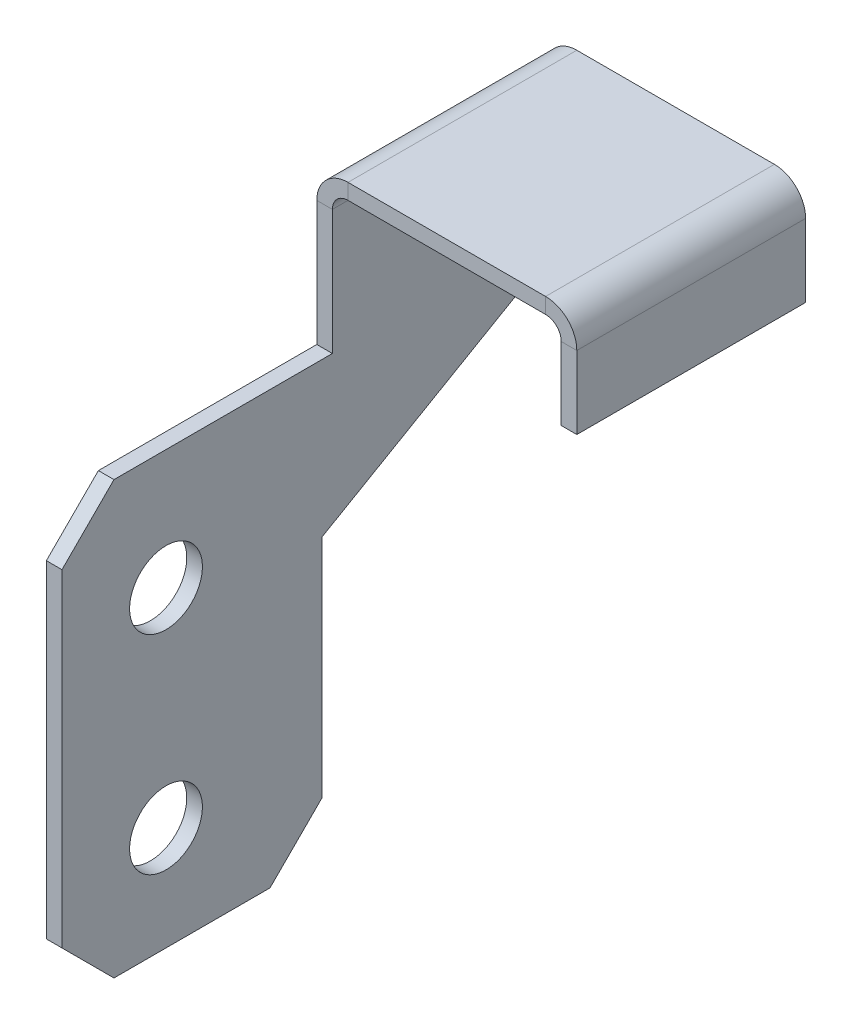
ISO-10303-21;
HEADER;
FILE_DESCRIPTION(('STEP AP214'),'2;1');
FILE_NAME('part.step','',(''),(''),'','','');
FILE_SCHEMA(('AUTOMOTIVE_DESIGN { 1 0 10303 214 1 1 1 1 }'));
ENDSEC;
DATA;
#1=APPLICATION_CONTEXT('core data for automotive mechanical design processes');
#2=APPLICATION_PROTOCOL_DEFINITION('international standard','automotive_design',2000,#1);
#3=PRODUCT_CONTEXT('',#1,'mechanical');
#4=PRODUCT('Part','Part','',(#3));
#5=PRODUCT_RELATED_PRODUCT_CATEGORY('part','',(#4));
#6=PRODUCT_DEFINITION_FORMATION('','',#4);
#7=PRODUCT_DEFINITION_CONTEXT('part definition',#1,'design');
#8=PRODUCT_DEFINITION('design','',#6,#7);
#9=PRODUCT_DEFINITION_SHAPE('','',#8);
#10=(LENGTH_UNIT() NAMED_UNIT(*) SI_UNIT(.MILLI.,.METRE.));
#11=(NAMED_UNIT(*) PLANE_ANGLE_UNIT() SI_UNIT($,.RADIAN.));
#12=(NAMED_UNIT(*) SI_UNIT($,.STERADIAN.) SOLID_ANGLE_UNIT());
#13=UNCERTAINTY_MEASURE_WITH_UNIT(LENGTH_MEASURE(1.E-05),#10,'distance_accuracy_value','');
#14=(GEOMETRIC_REPRESENTATION_CONTEXT(3) GLOBAL_UNCERTAINTY_ASSIGNED_CONTEXT((#13)) GLOBAL_UNIT_ASSIGNED_CONTEXT((#10,
#11,#12)) REPRESENTATION_CONTEXT('',''));
#15=CARTESIAN_POINT('',(0.,0.,0.));
#16=DIRECTION('',(0.,0.,1.));
#17=DIRECTION('',(1.,0.,0.));
#18=AXIS2_PLACEMENT_3D('',#15,#16,#17);
#19=CARTESIAN_POINT('',(26.,41.5,22.));
#20=DIRECTION('',(0.,0.,-1.));
#21=DIRECTION('',(-1.,0.,0.));
#22=AXIS2_PLACEMENT_3D('',#19,#20,#21);
#23=PLANE('',#22);
#24=DIRECTION('',(0.,1.,0.));
#25=VECTOR('',#24,1.);
#26=CARTESIAN_POINT('',(25.,56.5,22.));
#27=LINE('',#26,#25);
#28=CARTESIAN_POINT('',(25.,46.5,22.));
#29=VERTEX_POINT('',#28);
#30=CARTESIAN_POINT('',(25.,53.5,22.));
#31=VERTEX_POINT('',#30);
#32=EDGE_CURVE('E212',#29,#31,#27,.T.);
#33=ORIENTED_EDGE('',*,*,#32,.T.);
#34=DIRECTION('',(-1.,0.,0.));
#35=VECTOR('',#34,1.);
#36=CARTESIAN_POINT('',(25.,53.5,22.));
#37=LINE('',#36,#35);
#38=CARTESIAN_POINT('',(23.5,53.5,22.));
#39=VERTEX_POINT('',#38);
#40=EDGE_CURVE('E329',#31,#39,#37,.T.);
#41=ORIENTED_EDGE('',*,*,#40,.T.);
#42=DIRECTION('',(0.,1.,0.));
#43=VECTOR('',#42,1.);
#44=CARTESIAN_POINT('',(23.5,56.5,22.));
#45=LINE('',#44,#43);
#46=CARTESIAN_POINT('',(23.5,46.5,22.));
#47=VERTEX_POINT('',#46);
#48=EDGE_CURVE('E201',#47,#39,#45,.T.);
#49=ORIENTED_EDGE('',*,*,#48,.F.);
#50=DIRECTION('',(1.,0.,0.));
#51=VECTOR('',#50,1.);
#52=CARTESIAN_POINT('',(25.,46.5,22.));
#53=LINE('',#52,#51);
#54=EDGE_CURVE('E205',#47,#29,#53,.T.);
#55=ORIENTED_EDGE('',*,*,#54,.T.);
#56=EDGE_LOOP('',(#33,#41,#49,#55));
#57=FACE_BOUND('',#56,.T.);
#58=ADVANCED_FACE('F43',(#57),#23,.F.);
#59=DIRECTION('',(-1.,0.,0.));
#60=VECTOR('',#59,1.);
#61=CARTESIAN_POINT('',(0.,55.,22.));
#62=LINE('',#61,#60);
#63=CARTESIAN_POINT('',(22.,55.,22.));
#64=VERTEX_POINT('',#63);
#65=CARTESIAN_POINT('',(3.,55.,22.));
#66=VERTEX_POINT('',#65);
#67=EDGE_CURVE('E207',#64,#66,#62,.T.);
#68=ORIENTED_EDGE('',*,*,#67,.F.);
#69=DIRECTION('',(0.,1.,0.));
#70=VECTOR('',#69,1.);
#71=CARTESIAN_POINT('',(22.,55.,22.));
#72=LINE('',#71,#70);
#73=CARTESIAN_POINT('',(22.,56.5,22.));
#74=VERTEX_POINT('',#73);
#75=EDGE_CURVE('E327',#64,#74,#72,.T.);
#76=ORIENTED_EDGE('',*,*,#75,.T.);
#77=DIRECTION('',(-1.,0.,0.));
#78=VECTOR('',#77,1.);
#79=CARTESIAN_POINT('',(26.,56.5,22.));
#80=LINE('',#79,#78);
#81=CARTESIAN_POINT('',(3.,56.5,22.));
#82=VERTEX_POINT('',#81);
#83=EDGE_CURVE('E195',#74,#82,#80,.T.);
#84=ORIENTED_EDGE('',*,*,#83,.T.);
#85=DIRECTION('',(0.,-1.,0.));
#86=VECTOR('',#85,1.);
#87=CARTESIAN_POINT('',(3.,56.5,22.));
#88=LINE('',#87,#86);
#89=EDGE_CURVE('E323',#82,#66,#88,.T.);
#90=ORIENTED_EDGE('',*,*,#89,.T.);
#91=EDGE_LOOP('',(#68,#76,#84,#90));
#92=FACE_BOUND('',#91,.T.);
#93=ADVANCED_FACE('F378',(#92),#23,.F.);
#94=DIRECTION('',(0.,-1.,0.));
#95=VECTOR('',#94,1.);
#96=CARTESIAN_POINT('',(1.5,0.,22.));
#97=LINE('',#96,#95);
#98=CARTESIAN_POINT('',(1.5,53.5,22.));
#99=VERTEX_POINT('',#98);
#100=CARTESIAN_POINT('',(1.5,41.5,22.));
#101=VERTEX_POINT('',#100);
#102=EDGE_CURVE('E191',#99,#101,#97,.T.);
#103=ORIENTED_EDGE('',*,*,#102,.F.);
#104=DIRECTION('',(-1.,0.,0.));
#105=VECTOR('',#104,1.);
#106=CARTESIAN_POINT('',(1.5,53.5,22.));
#107=LINE('',#106,#105);
#108=CARTESIAN_POINT('',(0.,53.5,22.));
#109=VERTEX_POINT('',#108);
#110=EDGE_CURVE('E325',#99,#109,#107,.T.);
#111=ORIENTED_EDGE('',*,*,#110,.T.);
#112=DIRECTION('',(0.,-1.,0.));
#113=VECTOR('',#112,1.);
#114=CARTESIAN_POINT('',(0.,0.,22.));
#115=LINE('',#114,#113);
#116=CARTESIAN_POINT('',(0.,41.5,22.));
#117=VERTEX_POINT('',#116);
#118=EDGE_CURVE('E194',#109,#117,#115,.T.);
#119=ORIENTED_EDGE('',*,*,#118,.T.);
#120=DIRECTION('',(-1.,0.,0.));
#121=VECTOR('',#120,1.);
#122=CARTESIAN_POINT('',(26.,41.5,22.));
#123=LINE('',#122,#121);
#124=EDGE_CURVE('E178',#101,#117,#123,.T.);
#125=ORIENTED_EDGE('',*,*,#124,.F.);
#126=EDGE_LOOP('',(#103,#111,#119,#125));
#127=FACE_BOUND('',#126,.T.);
#128=ADVANCED_FACE('F190',(#127),#23,.F.);
#129=ORIENTED_EDGE('',*,*,#40,.F.);
#130=CARTESIAN_POINT('',(22.,53.5,22.));
#131=DIRECTION('',(0.,0.,-1.));
#132=DIRECTION('',(-1.,0.,0.));
#133=AXIS2_PLACEMENT_3D('',#130,#131,#132);
#134=CIRCLE('',#133,3.);
#135=EDGE_CURVE('E215',#31,#74,#134,.F.);
#136=ORIENTED_EDGE('',*,*,#135,.T.);
#137=ORIENTED_EDGE('',*,*,#75,.F.);
#138=CARTESIAN_POINT('',(22.,53.5,22.));
#139=DIRECTION('',(0.,0.,-1.));
#140=DIRECTION('',(-1.,0.,0.));
#141=AXIS2_PLACEMENT_3D('',#138,#139,#140);
#142=CIRCLE('',#141,1.5);
#143=EDGE_CURVE('E320',#39,#64,#142,.F.);
#144=ORIENTED_EDGE('',*,*,#143,.F.);
#145=EDGE_LOOP('',(#129,#136,#137,#144));
#146=FACE_BOUND('',#145,.T.);
#147=ADVANCED_FACE('F391',(#146),#23,.F.);
#148=CARTESIAN_POINT('',(22.,53.5,48.));
#149=DIRECTION('',(0.,0.,1.));
#150=DIRECTION('',(1.,0.,0.));
#151=AXIS2_PLACEMENT_3D('',#148,#149,#150);
#152=PLANE('',#151);
#153=DIRECTION('',(0.,1.,0.));
#154=VECTOR('',#153,1.);
#155=CARTESIAN_POINT('',(0.,0.,48.));
#156=LINE('',#155,#154);
#157=CARTESIAN_POINT('',(0.,5.00000000000004,48.));
#158=VERTEX_POINT('',#157);
#159=CARTESIAN_POINT('',(0.,36.5,48.));
#160=VERTEX_POINT('',#159);
#161=EDGE_CURVE('E250',#158,#160,#156,.T.);
#162=ORIENTED_EDGE('',*,*,#161,.F.);
#163=DIRECTION('',(1.,0.,0.));
#164=VECTOR('',#163,1.);
#165=CARTESIAN_POINT('',(22.,5.00000000000004,48.));
#166=LINE('',#165,#164);
#167=CARTESIAN_POINT('',(1.5,5.00000000000004,48.));
#168=VERTEX_POINT('',#167);
#169=EDGE_CURVE('E344',#158,#168,#166,.T.);
#170=ORIENTED_EDGE('',*,*,#169,.T.);
#171=DIRECTION('',(0.,1.,0.));
#172=VECTOR('',#171,1.);
#173=CARTESIAN_POINT('',(1.5,0.,48.));
#174=LINE('',#173,#172);
#175=CARTESIAN_POINT('',(1.5,36.5,48.));
#176=VERTEX_POINT('',#175);
#177=EDGE_CURVE('E252',#168,#176,#174,.T.);
#178=ORIENTED_EDGE('',*,*,#177,.T.);
#179=DIRECTION('',(-1.,0.,0.));
#180=VECTOR('',#179,1.);
#181=CARTESIAN_POINT('',(22.,36.5,48.));
#182=LINE('',#181,#180);
#183=EDGE_CURVE('E331',#176,#160,#182,.T.);
#184=ORIENTED_EDGE('',*,*,#183,.T.);
#185=EDGE_LOOP('',(#162,#170,#178,#184));
#186=FACE_BOUND('',#185,.T.);
#187=ADVANCED_FACE('F402',(#186),#152,.T.);
#188=CARTESIAN_POINT('',(0.,53.5,0.));
#189=DIRECTION('',(0.,0.,-1.));
#190=DIRECTION('',(-1.,0.,0.));
#191=AXIS2_PLACEMENT_3D('',#188,#189,#190);
#192=PLANE('',#191);
#193=DIRECTION('',(1.,0.,0.));
#194=VECTOR('',#193,1.);
#195=CARTESIAN_POINT('',(0.,53.5,0.));
#196=LINE('',#195,#194);
#197=CARTESIAN_POINT('',(0.,53.5,0.));
#198=VERTEX_POINT('',#197);
#199=CARTESIAN_POINT('',(1.5,53.5,0.));
#200=VERTEX_POINT('',#199);
#201=EDGE_CURVE('E317',#198,#200,#196,.T.);
#202=ORIENTED_EDGE('',*,*,#201,.F.);
#203=CARTESIAN_POINT('',(3.,53.5,0.));
#204=DIRECTION('',(0.,0.,1.));
#205=DIRECTION('',(1.,0.,0.));
#206=AXIS2_PLACEMENT_3D('',#203,#204,#205);
#207=CIRCLE('',#206,3.);
#208=CARTESIAN_POINT('',(3.,56.5,0.));
#209=VERTEX_POINT('',#208);
#210=EDGE_CURVE('E270',#198,#209,#207,.F.);
#211=ORIENTED_EDGE('',*,*,#210,.T.);
#212=DIRECTION('',(0.,1.,0.));
#213=VECTOR('',#212,1.);
#214=CARTESIAN_POINT('',(3.,55.,0.));
#215=LINE('',#214,#213);
#216=CARTESIAN_POINT('',(3.,55.,0.));
#217=VERTEX_POINT('',#216);
#218=EDGE_CURVE('E314',#217,#209,#215,.T.);
#219=ORIENTED_EDGE('',*,*,#218,.F.);
#220=CARTESIAN_POINT('',(3.,53.5,0.));
#221=DIRECTION('',(0.,0.,1.));
#222=DIRECTION('',(1.,0.,0.));
#223=AXIS2_PLACEMENT_3D('',#220,#221,#222);
#224=CIRCLE('',#223,1.5);
#225=EDGE_CURVE('E278',#200,#217,#224,.F.);
#226=ORIENTED_EDGE('',*,*,#225,.F.);
#227=EDGE_LOOP('',(#202,#211,#219,#226));
#228=FACE_BOUND('',#227,.T.);
#229=ADVANCED_FACE('F408',(#228),#192,.T.);
#230=CARTESIAN_POINT('',(3.,55.,0.));
#231=DIRECTION('',(0.,0.,-1.));
#232=DIRECTION('',(-1.,0.,0.));
#233=AXIS2_PLACEMENT_3D('',#230,#231,#232);
#234=PLANE('',#233);
#235=DIRECTION('',(-1.,0.,0.));
#236=VECTOR('',#235,1.);
#237=CARTESIAN_POINT('',(1.5,40.,0.));
#238=LINE('',#237,#236);
#239=CARTESIAN_POINT('',(1.5,40.,0.));
#240=VERTEX_POINT('',#239);
#241=CARTESIAN_POINT('',(0.,40.,0.));
#242=VERTEX_POINT('',#241);
#243=EDGE_CURVE('E244',#240,#242,#238,.T.);
#244=ORIENTED_EDGE('',*,*,#243,.T.);
#245=DIRECTION('',(0.,1.,0.));
#246=VECTOR('',#245,1.);
#247=CARTESIAN_POINT('',(0.,0.,0.));
#248=LINE('',#247,#246);
#249=EDGE_CURVE('E273',#242,#198,#248,.T.);
#250=ORIENTED_EDGE('',*,*,#249,.T.);
#251=ORIENTED_EDGE('',*,*,#201,.T.);
#252=DIRECTION('',(0.,1.,0.));
#253=VECTOR('',#252,1.);
#254=CARTESIAN_POINT('',(1.5,0.,0.));
#255=LINE('',#254,#253);
#256=EDGE_CURVE('E276',#240,#200,#255,.T.);
#257=ORIENTED_EDGE('',*,*,#256,.F.);
#258=EDGE_LOOP('',(#244,#250,#251,#257));
#259=FACE_BOUND('',#258,.T.);
#260=ADVANCED_FACE('F367',(#259),#234,.T.);
#261=CARTESIAN_POINT('',(22.,56.5,0.));
#262=DIRECTION('',(0.,0.,-1.));
#263=DIRECTION('',(-1.,0.,0.));
#264=AXIS2_PLACEMENT_3D('',#261,#262,#263);
#265=PLANE('',#264);
#266=DIRECTION('',(0.,-1.,0.));
#267=VECTOR('',#266,1.);
#268=CARTESIAN_POINT('',(22.,56.5,0.));
#269=LINE('',#268,#267);
#270=CARTESIAN_POINT('',(22.,56.5,0.));
#271=VERTEX_POINT('',#270);
#272=CARTESIAN_POINT('',(22.,55.,0.));
#273=VERTEX_POINT('',#272);
#274=EDGE_CURVE('E311',#271,#273,#269,.T.);
#275=ORIENTED_EDGE('',*,*,#274,.F.);
#276=CARTESIAN_POINT('',(22.,53.5,0.));
#277=DIRECTION('',(0.,0.,1.));
#278=DIRECTION('',(1.,0.,0.));
#279=AXIS2_PLACEMENT_3D('',#276,#277,#278);
#280=CIRCLE('',#279,3.);
#281=CARTESIAN_POINT('',(25.,53.5,0.));
#282=VERTEX_POINT('',#281);
#283=EDGE_CURVE('E264',#271,#282,#280,.F.);
#284=ORIENTED_EDGE('',*,*,#283,.T.);
#285=DIRECTION('',(1.,0.,0.));
#286=VECTOR('',#285,1.);
#287=CARTESIAN_POINT('',(23.5,53.5,0.));
#288=LINE('',#287,#286);
#289=CARTESIAN_POINT('',(23.5,53.5,0.));
#290=VERTEX_POINT('',#289);
#291=EDGE_CURVE('E308',#290,#282,#288,.T.);
#292=ORIENTED_EDGE('',*,*,#291,.F.);
#293=CARTESIAN_POINT('',(22.,53.5,0.));
#294=DIRECTION('',(0.,0.,1.));
#295=DIRECTION('',(1.,0.,0.));
#296=AXIS2_PLACEMENT_3D('',#293,#294,#295);
#297=CIRCLE('',#296,1.5);
#298=EDGE_CURVE('E253',#273,#290,#297,.F.);
#299=ORIENTED_EDGE('',*,*,#298,.F.);
#300=EDGE_LOOP('',(#275,#284,#292,#299));
#301=FACE_BOUND('',#300,.T.);
#302=ADVANCED_FACE('F430',(#301),#265,.T.);
#303=CARTESIAN_POINT('',(23.5,53.5,0.));
#304=DIRECTION('',(0.,0.,-1.));
#305=DIRECTION('',(-1.,0.,0.));
#306=AXIS2_PLACEMENT_3D('',#303,#304,#305);
#307=PLANE('',#306);
#308=DIRECTION('',(1.,0.,0.));
#309=VECTOR('',#308,1.);
#310=CARTESIAN_POINT('',(0.,56.5,0.));
#311=LINE('',#310,#309);
#312=EDGE_CURVE('E267',#209,#271,#311,.T.);
#313=ORIENTED_EDGE('',*,*,#312,.T.);
#314=ORIENTED_EDGE('',*,*,#274,.T.);
#315=DIRECTION('',(1.,0.,0.));
#316=VECTOR('',#315,1.);
#317=CARTESIAN_POINT('',(0.,55.,0.));
#318=LINE('',#317,#316);
#319=EDGE_CURVE('E281',#217,#273,#318,.T.);
#320=ORIENTED_EDGE('',*,*,#319,.F.);
#321=ORIENTED_EDGE('',*,*,#218,.T.);
#322=EDGE_LOOP('',(#313,#314,#320,#321));
#323=FACE_BOUND('',#322,.T.);
#324=ADVANCED_FACE('F434',(#323),#307,.T.);
#325=CARTESIAN_POINT('',(23.5,56.5,48.));
#326=DIRECTION('',(1.,0.,0.));
#327=DIRECTION('',(0.,0.,-1.));
#328=AXIS2_PLACEMENT_3D('',#325,#326,#327);
#329=PLANE('',#328);
#330=DIRECTION('',(0.,0.,-1.));
#331=VECTOR('',#330,1.);
#332=CARTESIAN_POINT('',(23.5,46.5,48.));
#333=LINE('',#332,#331);
#334=CARTESIAN_POINT('',(23.5,46.5,0.));
#335=VERTEX_POINT('',#334);
#336=EDGE_CURVE('E306',#47,#335,#333,.T.);
#337=ORIENTED_EDGE('',*,*,#336,.F.);
#338=ORIENTED_EDGE('',*,*,#48,.T.);
#339=DIRECTION('',(0.,0.,-1.));
#340=VECTOR('',#339,1.);
#341=CARTESIAN_POINT('',(23.5,53.5,48.));
#342=LINE('',#341,#340);
#343=EDGE_CURVE('E255',#39,#290,#342,.T.);
#344=ORIENTED_EDGE('',*,*,#343,.T.);
#345=DIRECTION('',(0.,1.,0.));
#346=VECTOR('',#345,1.);
#347=CARTESIAN_POINT('',(23.5,56.5,0.));
#348=LINE('',#347,#346);
#349=EDGE_CURVE('E247',#290,#335,#348,.F.);
#350=ORIENTED_EDGE('',*,*,#349,.T.);
#351=EDGE_LOOP('',(#337,#338,#344,#350));
#352=FACE_BOUND('',#351,.T.);
#353=ADVANCED_FACE('F464',(#352),#329,.F.);
#354=CARTESIAN_POINT('',(25.,46.5,48.));
#355=DIRECTION('',(0.,-1.,0.));
#356=DIRECTION('',(0.,0.,-1.));
#357=AXIS2_PLACEMENT_3D('',#354,#355,#356);
#358=PLANE('',#357);
#359=ORIENTED_EDGE('',*,*,#54,.F.);
#360=ORIENTED_EDGE('',*,*,#336,.T.);
#361=DIRECTION('',(-1.,0.,0.));
#362=VECTOR('',#361,1.);
#363=CARTESIAN_POINT('',(25.,46.5,0.));
#364=LINE('',#363,#362);
#365=CARTESIAN_POINT('',(25.,46.5,0.));
#366=VERTEX_POINT('',#365);
#367=EDGE_CURVE('E258',#366,#335,#364,.T.);
#368=ORIENTED_EDGE('',*,*,#367,.F.);
#369=DIRECTION('',(0.,0.,-1.));
#370=VECTOR('',#369,1.);
#371=CARTESIAN_POINT('',(25.,46.5,48.));
#372=LINE('',#371,#370);
#373=EDGE_CURVE('E304',#29,#366,#372,.T.);
#374=ORIENTED_EDGE('',*,*,#373,.F.);
#375=EDGE_LOOP('',(#359,#360,#368,#374));
#376=FACE_BOUND('',#375,.T.);
#377=ADVANCED_FACE('F466',(#376),#358,.T.);
#378=CARTESIAN_POINT('',(25.,56.5,48.));
#379=DIRECTION('',(1.,0.,0.));
#380=DIRECTION('',(0.,0.,-1.));
#381=AXIS2_PLACEMENT_3D('',#378,#379,#380);
#382=PLANE('',#381);
#383=ORIENTED_EDGE('',*,*,#32,.F.);
#384=ORIENTED_EDGE('',*,*,#373,.T.);
#385=DIRECTION('',(0.,-1.,0.));
#386=VECTOR('',#385,1.);
#387=CARTESIAN_POINT('',(25.,56.5,0.));
#388=LINE('',#387,#386);
#389=EDGE_CURVE('E261',#282,#366,#388,.T.);
#390=ORIENTED_EDGE('',*,*,#389,.F.);
#391=DIRECTION('',(0.,0.,-1.));
#392=VECTOR('',#391,1.);
#393=CARTESIAN_POINT('',(25.,53.5,48.));
#394=LINE('',#393,#392);
#395=EDGE_CURVE('E302',#31,#282,#394,.T.);
#396=ORIENTED_EDGE('',*,*,#395,.F.);
#397=EDGE_LOOP('',(#383,#384,#390,#396));
#398=FACE_BOUND('',#397,.T.);
#399=ADVANCED_FACE('F424',(#398),#382,.T.);
#400=CARTESIAN_POINT('',(22.,53.5,48.));
#401=DIRECTION('',(0.,0.,-1.));
#402=DIRECTION('',(-1.,0.,0.));
#403=AXIS2_PLACEMENT_3D('',#400,#401,#402);
#404=CYLINDRICAL_SURFACE('',#403,3.);
#405=ORIENTED_EDGE('',*,*,#135,.F.);
#406=ORIENTED_EDGE('',*,*,#395,.T.);
#407=ORIENTED_EDGE('',*,*,#283,.F.);
#408=DIRECTION('',(0.,0.,-1.));
#409=VECTOR('',#408,1.);
#410=CARTESIAN_POINT('',(22.,56.5,48.));
#411=LINE('',#410,#409);
#412=EDGE_CURVE('E300',#74,#271,#411,.T.);
#413=ORIENTED_EDGE('',*,*,#412,.F.);
#414=EDGE_LOOP('',(#405,#406,#407,#413));
#415=FACE_BOUND('',#414,.T.);
#416=ADVANCED_FACE('F421',(#415),#404,.T.);
#417=CARTESIAN_POINT('',(0.,56.5,48.));
#418=DIRECTION('',(0.,1.,0.));
#419=DIRECTION('',(0.,0.,1.));
#420=AXIS2_PLACEMENT_3D('',#417,#418,#419);
#421=PLANE('',#420);
#422=ORIENTED_EDGE('',*,*,#83,.F.);
#423=ORIENTED_EDGE('',*,*,#412,.T.);
#424=ORIENTED_EDGE('',*,*,#312,.F.);
#425=DIRECTION('',(0.,0.,-1.));
#426=VECTOR('',#425,1.);
#427=CARTESIAN_POINT('',(3.,56.5,48.));
#428=LINE('',#427,#426);
#429=EDGE_CURVE('E298',#82,#209,#428,.T.);
#430=ORIENTED_EDGE('',*,*,#429,.F.);
#431=EDGE_LOOP('',(#422,#423,#424,#430));
#432=FACE_BOUND('',#431,.T.);
#433=ADVANCED_FACE('F439',(#432),#421,.T.);
#434=CARTESIAN_POINT('',(3.,53.5,48.));
#435=DIRECTION('',(0.,0.,-1.));
#436=DIRECTION('',(-1.,0.,0.));
#437=AXIS2_PLACEMENT_3D('',#434,#435,#436);
#438=CYLINDRICAL_SURFACE('',#437,3.);
#439=CARTESIAN_POINT('',(3.,53.5,22.));
#440=DIRECTION('',(0.,0.,-1.));
#441=DIRECTION('',(-1.,0.,0.));
#442=AXIS2_PLACEMENT_3D('',#439,#440,#441);
#443=CIRCLE('',#442,3.);
#444=EDGE_CURVE('E219',#82,#109,#443,.F.);
#445=ORIENTED_EDGE('',*,*,#444,.F.);
#446=ORIENTED_EDGE('',*,*,#429,.T.);
#447=ORIENTED_EDGE('',*,*,#210,.F.);
#448=DIRECTION('',(0.,0.,-1.));
#449=VECTOR('',#448,1.);
#450=CARTESIAN_POINT('',(0.,53.5,48.));
#451=LINE('',#450,#449);
#452=EDGE_CURVE('E296',#109,#198,#451,.T.);
#453=ORIENTED_EDGE('',*,*,#452,.F.);
#454=EDGE_LOOP('',(#445,#446,#447,#453));
#455=FACE_BOUND('',#454,.T.);
#456=ADVANCED_FACE('F445',(#455),#438,.T.);
#457=CARTESIAN_POINT('',(0.,0.,48.));
#458=DIRECTION('',(-1.,0.,0.));
#459=DIRECTION('',(0.,0.,1.));
#460=AXIS2_PLACEMENT_3D('',#457,#458,#459);
#461=PLANE('',#460);
#462=DIRECTION('',(0.,1.,0.));
#463=VECTOR('',#462,1.);
#464=CARTESIAN_POINT('',(0.,0.,23.));
#465=LINE('',#464,#463);
#466=CARTESIAN_POINT('',(0.,5.00000000000004,23.));
#467=VERTEX_POINT('',#466);
#468=CARTESIAN_POINT('',(0.,26.7209438086387,23.));
#469=VERTEX_POINT('',#468);
#470=EDGE_CURVE('E226',#467,#469,#465,.T.);
#471=ORIENTED_EDGE('',*,*,#470,.F.);
#472=DIRECTION('',(0.,-0.707106781186548,0.707106781186548));
#473=VECTOR('',#472,1.);
#474=CARTESIAN_POINT('',(0.,-9.99999999999998,38.));
#475=LINE('',#474,#473);
#476=CARTESIAN_POINT('',(0.,0.,28.));
#477=VERTEX_POINT('',#476);
#478=EDGE_CURVE('E65',#467,#477,#475,.T.);
#479=ORIENTED_EDGE('',*,*,#478,.T.);
#480=DIRECTION('',(0.,0.,-1.));
#481=VECTOR('',#480,1.);
#482=CARTESIAN_POINT('',(0.,0.,48.));
#483=LINE('',#482,#481);
#484=CARTESIAN_POINT('',(0.,0.,43.));
#485=VERTEX_POINT('',#484);
#486=EDGE_CURVE('E294',#485,#477,#483,.T.);
#487=ORIENTED_EDGE('',*,*,#486,.F.);
#488=DIRECTION('',(0.,-0.707106781186548,-0.707106781186547));
#489=VECTOR('',#488,1.);
#490=CARTESIAN_POINT('',(0.,2.50000000000002,45.5));
#491=LINE('',#490,#489);
#492=EDGE_CURVE('E342',#485,#158,#491,.F.);
#493=ORIENTED_EDGE('',*,*,#492,.T.);
#494=ORIENTED_EDGE('',*,*,#161,.T.);
#495=DIRECTION('',(0.,-0.707106781186548,0.707106781186547));
#496=VECTOR('',#495,1.);
#497=CARTESIAN_POINT('',(0.,18.25,66.25));
#498=LINE('',#497,#496);
#499=CARTESIAN_POINT('',(0.,41.5,43.));
#500=VERTEX_POINT('',#499);
#501=EDGE_CURVE('E334',#160,#500,#498,.F.);
#502=ORIENTED_EDGE('',*,*,#501,.T.);
#503=DIRECTION('',(0.,0.,-1.));
#504=VECTOR('',#503,1.);
#505=CARTESIAN_POINT('',(0.,41.5,48.));
#506=LINE('',#505,#504);
#507=EDGE_CURVE('E185',#500,#117,#506,.T.);
#508=ORIENTED_EDGE('',*,*,#507,.T.);
#509=ORIENTED_EDGE('',*,*,#118,.F.);
#510=ORIENTED_EDGE('',*,*,#452,.T.);
#511=ORIENTED_EDGE('',*,*,#249,.F.);
#512=DIRECTION('',(0.,0.499999999999998,-0.86602540378444));
#513=VECTOR('',#512,1.);
#514=CARTESIAN_POINT('',(0.,26.7209438086387,23.));
#515=LINE('',#514,#513);
#516=EDGE_CURVE('E238',#469,#242,#515,.T.);
#517=ORIENTED_EDGE('',*,*,#516,.F.);
#518=EDGE_LOOP('',(#471,#479,#487,#493,#494,#502,#508,#509,#510,#511,#517));
#519=FACE_BOUND('',#518,.T.);
#520=CARTESIAN_POINT('',(0.,10.,38.));
#521=DIRECTION('',(-1.,0.,0.));
#522=DIRECTION('',(0.,0.,1.));
#523=AXIS2_PLACEMENT_3D('',#520,#521,#522);
#524=CIRCLE('',#523,3.5);
#525=CARTESIAN_POINT('',(0.,10.,41.5));
#526=VERTEX_POINT('',#525);
#527=EDGE_CURVE('E227',#526,#526,#524,.T.);
#528=ORIENTED_EDGE('',*,*,#527,.F.);
#529=EDGE_LOOP('',(#528));
#530=FACE_BOUND('',#529,.T.);
#531=CARTESIAN_POINT('',(0.,30.,38.));
#532=DIRECTION('',(-1.,0.,0.));
#533=DIRECTION('',(0.,0.,1.));
#534=AXIS2_PLACEMENT_3D('',#531,#532,#533);
#535=CIRCLE('',#534,3.5);
#536=CARTESIAN_POINT('',(0.,30.,41.5));
#537=VERTEX_POINT('',#536);
#538=EDGE_CURVE('E222',#537,#537,#535,.T.);
#539=ORIENTED_EDGE('',*,*,#538,.F.);
#540=EDGE_LOOP('',(#539));
#541=FACE_BOUND('',#540,.T.);
#542=ADVANCED_FACE('F359',(#519,#530,#541),#461,.T.);
#543=CARTESIAN_POINT('',(1.5,0.,48.));
#544=DIRECTION('',(0.,-1.,0.));
#545=DIRECTION('',(0.,0.,-1.));
#546=AXIS2_PLACEMENT_3D('',#543,#544,#545);
#547=PLANE('',#546);
#548=ORIENTED_EDGE('',*,*,#486,.T.);
#549=DIRECTION('',(1.,0.,0.));
#550=VECTOR('',#549,1.);
#551=CARTESIAN_POINT('',(1.5,0.,28.));
#552=LINE('',#551,#550);
#553=CARTESIAN_POINT('',(1.5,0.,28.));
#554=VERTEX_POINT('',#553);
#555=EDGE_CURVE('E51',#477,#554,#552,.T.);
#556=ORIENTED_EDGE('',*,*,#555,.T.);
#557=DIRECTION('',(0.,0.,-1.));
#558=VECTOR('',#557,1.);
#559=CARTESIAN_POINT('',(1.5,0.,48.));
#560=LINE('',#559,#558);
#561=CARTESIAN_POINT('',(1.5,0.,43.));
#562=VERTEX_POINT('',#561);
#563=EDGE_CURVE('E292',#562,#554,#560,.T.);
#564=ORIENTED_EDGE('',*,*,#563,.F.);
#565=DIRECTION('',(-1.,0.,0.));
#566=VECTOR('',#565,1.);
#567=CARTESIAN_POINT('',(1.5,0.,43.));
#568=LINE('',#567,#566);
#569=EDGE_CURVE('E339',#562,#485,#568,.T.);
#570=ORIENTED_EDGE('',*,*,#569,.T.);
#571=EDGE_LOOP('',(#548,#556,#564,#570));
#572=FACE_BOUND('',#571,.T.);
#573=ADVANCED_FACE('F674',(#572),#547,.T.);
#574=CARTESIAN_POINT('',(1.5,0.,48.));
#575=DIRECTION('',(-1.,0.,0.));
#576=DIRECTION('',(0.,0.,1.));
#577=AXIS2_PLACEMENT_3D('',#574,#575,#576);
#578=PLANE('',#577);
#579=CARTESIAN_POINT('',(1.5,10.,38.));
#580=DIRECTION('',(-1.,0.,0.));
#581=DIRECTION('',(0.,0.,1.));
#582=AXIS2_PLACEMENT_3D('',#579,#580,#581);
#583=CIRCLE('',#582,3.5);
#584=CARTESIAN_POINT('',(1.5,10.,41.5));
#585=VERTEX_POINT('',#584);
#586=EDGE_CURVE('E223',#585,#585,#583,.T.);
#587=ORIENTED_EDGE('',*,*,#586,.T.);
#588=EDGE_LOOP('',(#587));
#589=FACE_BOUND('',#588,.T.);
#590=CARTESIAN_POINT('',(1.5,30.,38.));
#591=DIRECTION('',(-1.,0.,0.));
#592=DIRECTION('',(0.,0.,1.));
#593=AXIS2_PLACEMENT_3D('',#590,#591,#592);
#594=CIRCLE('',#593,3.5);
#595=CARTESIAN_POINT('',(1.5,30.,41.5));
#596=VERTEX_POINT('',#595);
#597=EDGE_CURVE('E230',#596,#596,#594,.T.);
#598=ORIENTED_EDGE('',*,*,#597,.T.);
#599=EDGE_LOOP('',(#598));
#600=FACE_BOUND('',#599,.T.);
#601=ORIENTED_EDGE('',*,*,#563,.T.);
#602=DIRECTION('',(0.,0.707106781186548,-0.707106781186548));
#603=VECTOR('',#602,1.);
#604=CARTESIAN_POINT('',(1.5,5.00000000000004,23.));
#605=LINE('',#604,#603);
#606=CARTESIAN_POINT('',(1.5,5.00000000000004,23.));
#607=VERTEX_POINT('',#606);
#608=EDGE_CURVE('E11',#554,#607,#605,.T.);
#609=ORIENTED_EDGE('',*,*,#608,.T.);
#610=DIRECTION('',(0.,1.,0.));
#611=VECTOR('',#610,1.);
#612=CARTESIAN_POINT('',(1.5,0.,23.));
#613=LINE('',#612,#611);
#614=CARTESIAN_POINT('',(1.5,26.7209438086387,23.));
#615=VERTEX_POINT('',#614);
#616=EDGE_CURVE('E235',#607,#615,#613,.T.);
#617=ORIENTED_EDGE('',*,*,#616,.T.);
#618=DIRECTION('',(0.,0.499999999999998,-0.86602540378444));
#619=VECTOR('',#618,1.);
#620=CARTESIAN_POINT('',(1.5,26.7209438086387,23.));
#621=LINE('',#620,#619);
#622=EDGE_CURVE('E237',#615,#240,#621,.T.);
#623=ORIENTED_EDGE('',*,*,#622,.T.);
#624=ORIENTED_EDGE('',*,*,#256,.T.);
#625=DIRECTION('',(0.,0.,-1.));
#626=VECTOR('',#625,1.);
#627=CARTESIAN_POINT('',(1.5,53.5,48.));
#628=LINE('',#627,#626);
#629=EDGE_CURVE('E200',#99,#200,#628,.T.);
#630=ORIENTED_EDGE('',*,*,#629,.F.);
#631=ORIENTED_EDGE('',*,*,#102,.T.);
#632=DIRECTION('',(0.,0.,-1.));
#633=VECTOR('',#632,1.);
#634=CARTESIAN_POINT('',(1.5,41.5,48.));
#635=LINE('',#634,#633);
#636=CARTESIAN_POINT('',(1.5,41.5,43.));
#637=VERTEX_POINT('',#636);
#638=EDGE_CURVE('E174',#637,#101,#635,.T.);
#639=ORIENTED_EDGE('',*,*,#638,.F.);
#640=DIRECTION('',(0.,0.707106781186548,-0.707106781186547));
#641=VECTOR('',#640,1.);
#642=CARTESIAN_POINT('',(1.5,36.5,48.));
#643=LINE('',#642,#641);
#644=EDGE_CURVE('E337',#637,#176,#643,.F.);
#645=ORIENTED_EDGE('',*,*,#644,.T.);
#646=ORIENTED_EDGE('',*,*,#177,.F.);
#647=DIRECTION('',(0.,0.707106781186548,0.707106781186547));
#648=VECTOR('',#647,1.);
#649=CARTESIAN_POINT('',(1.5,0.,43.));
#650=LINE('',#649,#648);
#651=EDGE_CURVE('E346',#168,#562,#650,.F.);
#652=ORIENTED_EDGE('',*,*,#651,.T.);
#653=EDGE_LOOP('',(#601,#609,#617,#623,#624,#630,#631,#639,#645,#646,#652));
#654=FACE_BOUND('',#653,.T.);
#655=ADVANCED_FACE('F198',(#589,#600,#654),#578,.F.);
#656=CARTESIAN_POINT('',(3.,53.5,48.));
#657=DIRECTION('',(0.,0.,-1.));
#658=DIRECTION('',(-1.,0.,0.));
#659=AXIS2_PLACEMENT_3D('',#656,#657,#658);
#660=CYLINDRICAL_SURFACE('',#659,1.5);
#661=DIRECTION('',(0.,0.,-1.));
#662=VECTOR('',#661,1.);
#663=CARTESIAN_POINT('',(3.,55.,48.));
#664=LINE('',#663,#662);
#665=EDGE_CURVE('E289',#66,#217,#664,.T.);
#666=ORIENTED_EDGE('',*,*,#665,.F.);
#667=CARTESIAN_POINT('',(3.,53.5,22.));
#668=DIRECTION('',(0.,0.,-1.));
#669=DIRECTION('',(-1.,0.,0.));
#670=AXIS2_PLACEMENT_3D('',#667,#668,#669);
#671=CIRCLE('',#670,1.5);
#672=EDGE_CURVE('E202',#66,#99,#671,.F.);
#673=ORIENTED_EDGE('',*,*,#672,.T.);
#674=ORIENTED_EDGE('',*,*,#629,.T.);
#675=ORIENTED_EDGE('',*,*,#225,.T.);
#676=EDGE_LOOP('',(#666,#673,#674,#675));
#677=FACE_BOUND('',#676,.T.);
#678=ADVANCED_FACE('F627',(#677),#660,.F.);
#679=CARTESIAN_POINT('',(0.,55.,48.));
#680=DIRECTION('',(0.,1.,0.));
#681=DIRECTION('',(0.,0.,1.));
#682=AXIS2_PLACEMENT_3D('',#679,#680,#681);
#683=PLANE('',#682);
#684=DIRECTION('',(0.,0.,-1.));
#685=VECTOR('',#684,1.);
#686=CARTESIAN_POINT('',(22.,55.,48.));
#687=LINE('',#686,#685);
#688=EDGE_CURVE('E287',#64,#273,#687,.T.);
#689=ORIENTED_EDGE('',*,*,#688,.F.);
#690=ORIENTED_EDGE('',*,*,#67,.T.);
#691=ORIENTED_EDGE('',*,*,#665,.T.);
#692=ORIENTED_EDGE('',*,*,#319,.T.);
#693=EDGE_LOOP('',(#689,#690,#691,#692));
#694=FACE_BOUND('',#693,.T.);
#695=ADVANCED_FACE('F459',(#694),#683,.F.);
#696=CARTESIAN_POINT('',(22.,53.5,48.));
#697=DIRECTION('',(0.,0.,-1.));
#698=DIRECTION('',(-1.,0.,0.));
#699=AXIS2_PLACEMENT_3D('',#696,#697,#698);
#700=CYLINDRICAL_SURFACE('',#699,1.5);
#701=ORIENTED_EDGE('',*,*,#343,.F.);
#702=ORIENTED_EDGE('',*,*,#143,.T.);
#703=ORIENTED_EDGE('',*,*,#688,.T.);
#704=ORIENTED_EDGE('',*,*,#298,.T.);
#705=EDGE_LOOP('',(#701,#702,#703,#704));
#706=FACE_BOUND('',#705,.T.);
#707=ADVANCED_FACE('F458',(#706),#700,.F.);
#708=CARTESIAN_POINT('',(22.,53.5,0.));
#709=DIRECTION('',(0.,0.,1.));
#710=DIRECTION('',(1.,0.,0.));
#711=AXIS2_PLACEMENT_3D('',#708,#709,#710);
#712=PLANE('',#711);
#713=ORIENTED_EDGE('',*,*,#349,.F.);
#714=ORIENTED_EDGE('',*,*,#291,.T.);
#715=ORIENTED_EDGE('',*,*,#389,.T.);
#716=ORIENTED_EDGE('',*,*,#367,.T.);
#717=EDGE_LOOP('',(#713,#714,#715,#716));
#718=FACE_BOUND('',#717,.T.);
#719=ADVANCED_FACE('F461',(#718),#712,.F.);
#720=CARTESIAN_POINT('',(1.5,26.7209438086387,23.));
#721=DIRECTION('',(0.,0.86602540378444,0.499999999999998));
#722=DIRECTION('',(0.,-0.499999999999998,0.86602540378444));
#723=AXIS2_PLACEMENT_3D('',#720,#721,#722);
#724=PLANE('',#723);
#725=ORIENTED_EDGE('',*,*,#516,.T.);
#726=ORIENTED_EDGE('',*,*,#243,.F.);
#727=ORIENTED_EDGE('',*,*,#622,.F.);
#728=DIRECTION('',(-1.,0.,0.));
#729=VECTOR('',#728,1.);
#730=CARTESIAN_POINT('',(1.5,26.7209438086387,23.));
#731=LINE('',#730,#729);
#732=EDGE_CURVE('E241',#615,#469,#731,.T.);
#733=ORIENTED_EDGE('',*,*,#732,.T.);
#734=EDGE_LOOP('',(#725,#726,#727,#733));
#735=FACE_BOUND('',#734,.T.);
#736=ADVANCED_FACE('F363',(#735),#724,.F.);
#737=CARTESIAN_POINT('',(1.5,0.,23.));
#738=DIRECTION('',(0.,0.,1.));
#739=DIRECTION('',(1.,0.,0.));
#740=AXIS2_PLACEMENT_3D('',#737,#738,#739);
#741=PLANE('',#740);
#742=ORIENTED_EDGE('',*,*,#616,.F.);
#743=DIRECTION('',(-1.,0.,0.));
#744=VECTOR('',#743,1.);
#745=CARTESIAN_POINT('',(0.,5.00000000000004,23.));
#746=LINE('',#745,#744);
#747=EDGE_CURVE('E348',#607,#467,#746,.T.);
#748=ORIENTED_EDGE('',*,*,#747,.T.);
#749=ORIENTED_EDGE('',*,*,#470,.T.);
#750=ORIENTED_EDGE('',*,*,#732,.F.);
#751=EDGE_LOOP('',(#742,#748,#749,#750));
#752=FACE_BOUND('',#751,.T.);
#753=ADVANCED_FACE('F354',(#752),#741,.F.);
#754=CARTESIAN_POINT('',(1.5,30.,38.));
#755=DIRECTION('',(-1.,0.,0.));
#756=DIRECTION('',(0.,0.,1.));
#757=AXIS2_PLACEMENT_3D('',#754,#755,#756);
#758=CYLINDRICAL_SURFACE('',#757,3.5);
#759=ORIENTED_EDGE('',*,*,#597,.F.);
#760=EDGE_LOOP('',(#759));
#761=FACE_BOUND('',#760,.T.);
#762=ORIENTED_EDGE('',*,*,#538,.T.);
#763=EDGE_LOOP('',(#762));
#764=FACE_BOUND('',#763,.T.);
#765=ADVANCED_FACE('F521',(#761,#764),#758,.F.);
#766=CARTESIAN_POINT('',(1.5,10.,38.));
#767=DIRECTION('',(-1.,0.,0.));
#768=DIRECTION('',(0.,0.,1.));
#769=AXIS2_PLACEMENT_3D('',#766,#767,#768);
#770=CYLINDRICAL_SURFACE('',#769,3.5);
#771=ORIENTED_EDGE('',*,*,#586,.F.);
#772=EDGE_LOOP('',(#771));
#773=FACE_BOUND('',#772,.T.);
#774=ORIENTED_EDGE('',*,*,#527,.T.);
#775=EDGE_LOOP('',(#774));
#776=FACE_BOUND('',#775,.T.);
#777=ADVANCED_FACE('F400',(#773,#776),#770,.F.);
#778=CARTESIAN_POINT('',(0.,41.5,0.));
#779=DIRECTION('',(0.,1.,0.));
#780=DIRECTION('',(0.,0.,1.));
#781=AXIS2_PLACEMENT_3D('',#778,#779,#780);
#782=PLANE('',#781);
#783=ORIENTED_EDGE('',*,*,#507,.F.);
#784=DIRECTION('',(1.,0.,0.));
#785=VECTOR('',#784,1.);
#786=CARTESIAN_POINT('',(0.,41.5,43.));
#787=LINE('',#786,#785);
#788=EDGE_CURVE('E180',#500,#637,#787,.T.);
#789=ORIENTED_EDGE('',*,*,#788,.T.);
#790=ORIENTED_EDGE('',*,*,#638,.T.);
#791=ORIENTED_EDGE('',*,*,#124,.T.);
#792=EDGE_LOOP('',(#783,#789,#790,#791));
#793=FACE_BOUND('',#792,.T.);
#794=ADVANCED_FACE('F177',(#793),#782,.T.);
#795=ORIENTED_EDGE('',*,*,#110,.F.);
#796=ORIENTED_EDGE('',*,*,#672,.F.);
#797=ORIENTED_EDGE('',*,*,#89,.F.);
#798=ORIENTED_EDGE('',*,*,#444,.T.);
#799=EDGE_LOOP('',(#795,#796,#797,#798));
#800=FACE_BOUND('',#799,.T.);
#801=ADVANCED_FACE('F381',(#800),#23,.F.);
#802=CARTESIAN_POINT('',(22.,36.5,48.));
#803=DIRECTION('',(0.,-0.707106781186547,-0.707106781186548));
#804=DIRECTION('',(-1.,0.,0.));
#805=AXIS2_PLACEMENT_3D('',#802,#803,#804);
#806=PLANE('',#805);
#807=ORIENTED_EDGE('',*,*,#644,.F.);
#808=ORIENTED_EDGE('',*,*,#788,.F.);
#809=ORIENTED_EDGE('',*,*,#501,.F.);
#810=ORIENTED_EDGE('',*,*,#183,.F.);
#811=EDGE_LOOP('',(#807,#808,#809,#810));
#812=FACE_BOUND('',#811,.T.);
#813=ADVANCED_FACE('F375',(#812),#806,.F.);
#814=CARTESIAN_POINT('',(1.5,0.,43.));
#815=DIRECTION('',(0.,0.707106781186547,-0.707106781186548));
#816=DIRECTION('',(-1.,0.,0.));
#817=AXIS2_PLACEMENT_3D('',#814,#815,#816);
#818=PLANE('',#817);
#819=ORIENTED_EDGE('',*,*,#651,.F.);
#820=ORIENTED_EDGE('',*,*,#169,.F.);
#821=ORIENTED_EDGE('',*,*,#492,.F.);
#822=ORIENTED_EDGE('',*,*,#569,.F.);
#823=EDGE_LOOP('',(#819,#820,#821,#822));
#824=FACE_BOUND('',#823,.T.);
#825=ADVANCED_FACE('F371',(#824),#818,.F.);
#826=CARTESIAN_POINT('',(1.5,5.00000000000004,23.));
#827=DIRECTION('',(0.,-0.707106781186547,-0.707106781186547));
#828=DIRECTION('',(1.,0.,0.));
#829=AXIS2_PLACEMENT_3D('',#826,#827,#828);
#830=PLANE('',#829);
#831=ORIENTED_EDGE('',*,*,#608,.F.);
#832=ORIENTED_EDGE('',*,*,#555,.F.);
#833=ORIENTED_EDGE('',*,*,#478,.F.);
#834=ORIENTED_EDGE('',*,*,#747,.F.);
#835=EDGE_LOOP('',(#831,#832,#833,#834));
#836=FACE_BOUND('',#835,.T.);
#837=ADVANCED_FACE('F45',(#836),#830,.T.);
#838=CLOSED_SHELL('',(#58,#93,#128,#147,#187,#229,#260,#302,#324,#353,#377,#399,#416,#433,#456,
#542,#573,#655,#678,#695,#707,#719,#736,#753,#765,#777,#794,#801,#813,#825,#837));
#839=MANIFOLD_SOLID_BREP('B2',#838);
#840=ADVANCED_BREP_SHAPE_REPRESENTATION('',(#18,#839),#14);
#841=SHAPE_DEFINITION_REPRESENTATION(#9,#840);
ENDSEC;
END-ISO-10303-21;
